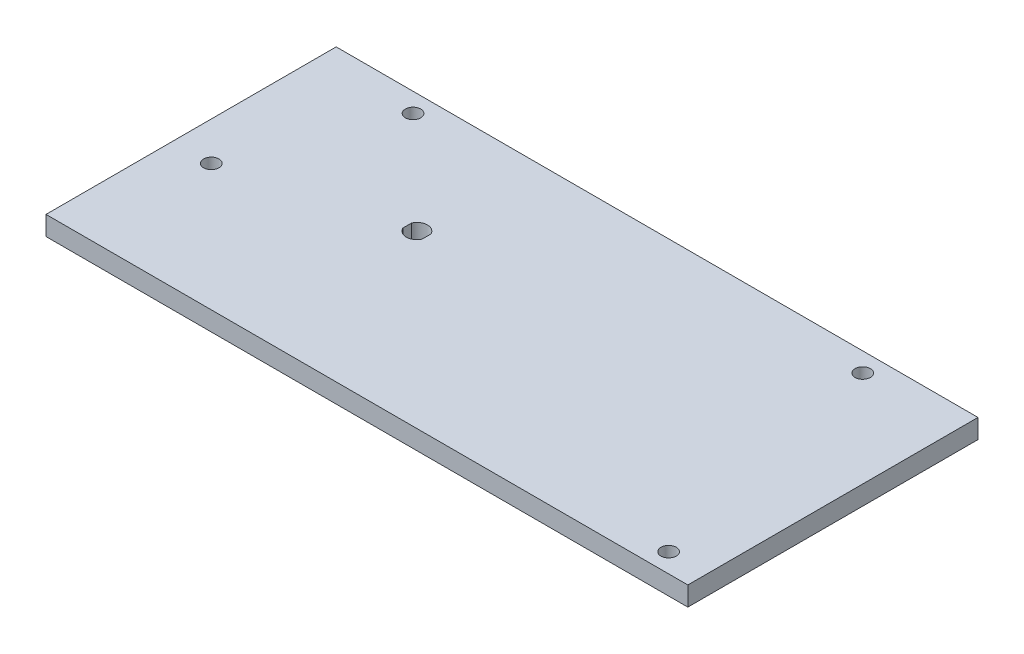
ISO-10303-21;
HEADER;
FILE_DESCRIPTION(('STEP AP214'),'2;1');
FILE_NAME('part.step','',(''),(''),'','','');
FILE_SCHEMA(('AUTOMOTIVE_DESIGN { 1 0 10303 214 1 1 1 1 }'));
ENDSEC;
DATA;
#1=APPLICATION_CONTEXT('core data for automotive mechanical design processes');
#2=APPLICATION_PROTOCOL_DEFINITION('international standard','automotive_design',2000,#1);
#3=PRODUCT_CONTEXT('',#1,'mechanical');
#4=PRODUCT('Part','Part','',(#3));
#5=PRODUCT_RELATED_PRODUCT_CATEGORY('part','',(#4));
#6=PRODUCT_DEFINITION_FORMATION('','',#4);
#7=PRODUCT_DEFINITION_CONTEXT('part definition',#1,'design');
#8=PRODUCT_DEFINITION('design','',#6,#7);
#9=PRODUCT_DEFINITION_SHAPE('','',#8);
#10=(LENGTH_UNIT() NAMED_UNIT(*) SI_UNIT(.MILLI.,.METRE.));
#11=(NAMED_UNIT(*) PLANE_ANGLE_UNIT() SI_UNIT($,.RADIAN.));
#12=(NAMED_UNIT(*) SI_UNIT($,.STERADIAN.) SOLID_ANGLE_UNIT());
#13=UNCERTAINTY_MEASURE_WITH_UNIT(LENGTH_MEASURE(1.E-05),#10,'distance_accuracy_value','');
#14=(GEOMETRIC_REPRESENTATION_CONTEXT(3) GLOBAL_UNCERTAINTY_ASSIGNED_CONTEXT((#13)) GLOBAL_UNIT_ASSIGNED_CONTEXT((#10,
#11,#12)) REPRESENTATION_CONTEXT('',''));
#15=CARTESIAN_POINT('',(0.,0.,0.));
#16=DIRECTION('',(0.,0.,1.));
#17=DIRECTION('',(1.,0.,0.));
#18=AXIS2_PLACEMENT_3D('',#15,#16,#17);
#19=CARTESIAN_POINT('',(0.,5.,0.));
#20=DIRECTION('',(0.,-1.,0.));
#21=DIRECTION('',(0.,0.,-1.));
#22=AXIS2_PLACEMENT_3D('',#19,#20,#21);
#23=PLANE('',#22);
#24=CARTESIAN_POINT('',(73.5,5.,32.75));
#25=DIRECTION('',(0.,1.,0.));
#26=DIRECTION('',(0.,0.,1.));
#27=AXIS2_PLACEMENT_3D('',#24,#25,#26);
#28=CIRCLE('',#27,2.);
#29=CARTESIAN_POINT('',(73.5,5.,34.75));
#30=VERTEX_POINT('',#29);
#31=EDGE_CURVE('E156',#30,#30,#28,.T.);
#32=ORIENTED_EDGE('',*,*,#31,.F.);
#33=EDGE_LOOP('',(#32));
#34=FACE_BOUND('',#33,.T.);
#35=CARTESIAN_POINT('',(-73.5,5.,4.75000000000001));
#36=DIRECTION('',(0.,1.,0.));
#37=DIRECTION('',(0.,0.,1.));
#38=AXIS2_PLACEMENT_3D('',#35,#36,#37);
#39=CIRCLE('',#38,2.);
#40=CARTESIAN_POINT('',(-73.5,5.,6.75000000000001));
#41=VERTEX_POINT('',#40);
#42=EDGE_CURVE('E164',#41,#41,#39,.T.);
#43=ORIENTED_EDGE('',*,*,#42,.F.);
#44=EDGE_LOOP('',(#43));
#45=FACE_BOUND('',#44,.T.);
#46=CARTESIAN_POINT('',(58.5,5.,-32.75));
#47=DIRECTION('',(0.,1.,0.));
#48=DIRECTION('',(0.,0.,1.));
#49=AXIS2_PLACEMENT_3D('',#46,#47,#48);
#50=CIRCLE('',#49,2.);
#51=CARTESIAN_POINT('',(58.5,5.,-30.75));
#52=VERTEX_POINT('',#51);
#53=EDGE_CURVE('E172',#52,#52,#50,.T.);
#54=ORIENTED_EDGE('',*,*,#53,.F.);
#55=EDGE_LOOP('',(#54));
#56=FACE_BOUND('',#55,.T.);
#57=CARTESIAN_POINT('',(-58.5,5.,-32.75));
#58=DIRECTION('',(0.,1.,0.));
#59=DIRECTION('',(0.,0.,1.));
#60=AXIS2_PLACEMENT_3D('',#57,#58,#59);
#61=CIRCLE('',#60,2.);
#62=CARTESIAN_POINT('',(-58.5,5.,-30.75));
#63=VERTEX_POINT('',#62);
#64=EDGE_CURVE('E180',#63,#63,#61,.T.);
#65=ORIENTED_EDGE('',*,*,#64,.F.);
#66=EDGE_LOOP('',(#65));
#67=FACE_BOUND('',#66,.T.);
#68=DIRECTION('',(0.,0.,-1.));
#69=VECTOR('',#68,1.);
#70=CARTESIAN_POINT('',(83.5,5.,37.75));
#71=LINE('',#70,#69);
#72=CARTESIAN_POINT('',(83.5,5.,37.75));
#73=VERTEX_POINT('',#72);
#74=CARTESIAN_POINT('',(83.5,5.,-37.75));
#75=VERTEX_POINT('',#74);
#76=EDGE_CURVE('E188',#73,#75,#71,.T.);
#77=ORIENTED_EDGE('',*,*,#76,.T.);
#78=DIRECTION('',(-1.,0.,0.));
#79=VECTOR('',#78,1.);
#80=CARTESIAN_POINT('',(-83.5,5.,-37.75));
#81=LINE('',#80,#79);
#82=CARTESIAN_POINT('',(-83.5,5.,-37.75));
#83=VERTEX_POINT('',#82);
#84=EDGE_CURVE('E192',#75,#83,#81,.T.);
#85=ORIENTED_EDGE('',*,*,#84,.T.);
#86=DIRECTION('',(0.,0.,1.));
#87=VECTOR('',#86,1.);
#88=CARTESIAN_POINT('',(-83.5,5.,37.75));
#89=LINE('',#88,#87);
#90=CARTESIAN_POINT('',(-83.5,5.,37.75));
#91=VERTEX_POINT('',#90);
#92=EDGE_CURVE('E196',#83,#91,#89,.T.);
#93=ORIENTED_EDGE('',*,*,#92,.T.);
#94=DIRECTION('',(1.,0.,0.));
#95=VECTOR('',#94,1.);
#96=CARTESIAN_POINT('',(-83.5,5.,37.75));
#97=LINE('',#96,#95);
#98=EDGE_CURVE('E199',#91,#73,#97,.T.);
#99=ORIENTED_EDGE('',*,*,#98,.T.);
#100=EDGE_LOOP('',(#77,#85,#93,#99));
#101=FACE_BOUND('',#100,.T.);
#102=DIRECTION('',(0.,0.,1.));
#103=VECTOR('',#102,1.);
#104=CARTESIAN_POINT('',(-29.,5.,0.));
#105=LINE('',#104,#103);
#106=CARTESIAN_POINT('',(-29.,5.,-7.89564392373895));
#107=VERTEX_POINT('',#106);
#108=CARTESIAN_POINT('',(-29.,5.,-5.60435607626103));
#109=VERTEX_POINT('',#108);
#110=EDGE_CURVE('E61',#107,#109,#105,.T.);
#111=ORIENTED_EDGE('',*,*,#110,.T.);
#112=CARTESIAN_POINT('',(-31.5,5.,-6.74999999999999));
#113=DIRECTION('',(0.,1.,0.));
#114=DIRECTION('',(0.,0.,1.));
#115=AXIS2_PLACEMENT_3D('',#112,#113,#114);
#116=CIRCLE('',#115,2.75);
#117=CARTESIAN_POINT('',(-34.,5.,-5.60435607626103));
#118=VERTEX_POINT('',#117);
#119=EDGE_CURVE('E131',#118,#109,#116,.T.);
#120=ORIENTED_EDGE('',*,*,#119,.F.);
#121=DIRECTION('',(0.,0.,1.));
#122=VECTOR('',#121,1.);
#123=CARTESIAN_POINT('',(-34.,5.,0.));
#124=LINE('',#123,#122);
#125=CARTESIAN_POINT('',(-34.,5.,-7.89564392373894));
#126=VERTEX_POINT('',#125);
#127=EDGE_CURVE('E135',#126,#118,#124,.T.);
#128=ORIENTED_EDGE('',*,*,#127,.F.);
#129=EDGE_CURVE('E137',#107,#126,#116,.T.);
#130=ORIENTED_EDGE('',*,*,#129,.F.);
#131=EDGE_LOOP('',(#111,#120,#128,#130));
#132=FACE_BOUND('',#131,.T.);
#133=ADVANCED_FACE('F45',(#34,#45,#56,#67,#101,#132),#23,.F.);
#134=CARTESIAN_POINT('',(0.,0.,0.));
#135=DIRECTION('',(0.,-1.,0.));
#136=DIRECTION('',(0.,0.,-1.));
#137=AXIS2_PLACEMENT_3D('',#134,#135,#136);
#138=PLANE('',#137);
#139=CARTESIAN_POINT('',(-73.5,0.,4.75000000000001));
#140=DIRECTION('',(0.,1.,0.));
#141=DIRECTION('',(0.,0.,1.));
#142=AXIS2_PLACEMENT_3D('',#139,#140,#141);
#143=CIRCLE('',#142,2.);
#144=CARTESIAN_POINT('',(-73.5,0.,6.75000000000001));
#145=VERTEX_POINT('',#144);
#146=EDGE_CURVE('E160',#145,#145,#143,.T.);
#147=ORIENTED_EDGE('',*,*,#146,.T.);
#148=EDGE_LOOP('',(#147));
#149=FACE_BOUND('',#148,.T.);
#150=CARTESIAN_POINT('',(-58.5,0.,-32.75));
#151=DIRECTION('',(0.,1.,0.));
#152=DIRECTION('',(0.,0.,1.));
#153=AXIS2_PLACEMENT_3D('',#150,#151,#152);
#154=CIRCLE('',#153,2.);
#155=CARTESIAN_POINT('',(-58.5,0.,-30.75));
#156=VERTEX_POINT('',#155);
#157=EDGE_CURVE('E176',#156,#156,#154,.T.);
#158=ORIENTED_EDGE('',*,*,#157,.T.);
#159=EDGE_LOOP('',(#158));
#160=FACE_BOUND('',#159,.T.);
#161=DIRECTION('',(0.,0.,-1.));
#162=VECTOR('',#161,1.);
#163=CARTESIAN_POINT('',(83.5,0.,37.75));
#164=LINE('',#163,#162);
#165=CARTESIAN_POINT('',(83.5,0.,37.75));
#166=VERTEX_POINT('',#165);
#167=CARTESIAN_POINT('',(83.5,0.,-37.75));
#168=VERTEX_POINT('',#167);
#169=EDGE_CURVE('E184',#166,#168,#164,.T.);
#170=ORIENTED_EDGE('',*,*,#169,.F.);
#171=DIRECTION('',(1.,0.,0.));
#172=VECTOR('',#171,1.);
#173=CARTESIAN_POINT('',(-83.5,0.,37.75));
#174=LINE('',#173,#172);
#175=CARTESIAN_POINT('',(-83.5,0.,37.75));
#176=VERTEX_POINT('',#175);
#177=EDGE_CURVE('E193',#176,#166,#174,.T.);
#178=ORIENTED_EDGE('',*,*,#177,.F.);
#179=DIRECTION('',(0.,0.,1.));
#180=VECTOR('',#179,1.);
#181=CARTESIAN_POINT('',(-83.5,0.,37.75));
#182=LINE('',#181,#180);
#183=CARTESIAN_POINT('',(-83.5,0.,-37.75));
#184=VERTEX_POINT('',#183);
#185=EDGE_CURVE('E209',#184,#176,#182,.T.);
#186=ORIENTED_EDGE('',*,*,#185,.F.);
#187=DIRECTION('',(-1.,0.,0.));
#188=VECTOR('',#187,1.);
#189=CARTESIAN_POINT('',(-83.5,0.,-37.75));
#190=LINE('',#189,#188);
#191=EDGE_CURVE('E206',#168,#184,#190,.T.);
#192=ORIENTED_EDGE('',*,*,#191,.F.);
#193=EDGE_LOOP('',(#170,#178,#186,#192));
#194=FACE_BOUND('',#193,.T.);
#195=CARTESIAN_POINT('',(58.5,0.,-32.75));
#196=DIRECTION('',(0.,1.,0.));
#197=DIRECTION('',(0.,0.,1.));
#198=AXIS2_PLACEMENT_3D('',#195,#196,#197);
#199=CIRCLE('',#198,2.);
#200=CARTESIAN_POINT('',(58.5,0.,-30.75));
#201=VERTEX_POINT('',#200);
#202=EDGE_CURVE('E168',#201,#201,#199,.T.);
#203=ORIENTED_EDGE('',*,*,#202,.T.);
#204=EDGE_LOOP('',(#203));
#205=FACE_BOUND('',#204,.T.);
#206=CARTESIAN_POINT('',(73.5,0.,32.75));
#207=DIRECTION('',(0.,1.,0.));
#208=DIRECTION('',(0.,0.,1.));
#209=AXIS2_PLACEMENT_3D('',#206,#207,#208);
#210=CIRCLE('',#209,2.);
#211=CARTESIAN_POINT('',(73.5,0.,34.75));
#212=VERTEX_POINT('',#211);
#213=EDGE_CURVE('E150',#212,#212,#210,.T.);
#214=ORIENTED_EDGE('',*,*,#213,.T.);
#215=EDGE_LOOP('',(#214));
#216=FACE_BOUND('',#215,.T.);
#217=CARTESIAN_POINT('',(-31.5,0.,-6.74999999999999));
#218=DIRECTION('',(0.,1.,0.));
#219=DIRECTION('',(0.,0.,1.));
#220=AXIS2_PLACEMENT_3D('',#217,#218,#219);
#221=CIRCLE('',#220,2.75);
#222=CARTESIAN_POINT('',(-34.,0.,-5.60435607626103));
#223=VERTEX_POINT('',#222);
#224=CARTESIAN_POINT('',(-29.,0.,-5.60435607626103));
#225=VERTEX_POINT('',#224);
#226=EDGE_CURVE('E119',#223,#225,#221,.T.);
#227=ORIENTED_EDGE('',*,*,#226,.T.);
#228=DIRECTION('',(0.,0.,1.));
#229=VECTOR('',#228,1.);
#230=CARTESIAN_POINT('',(-29.,0.,0.));
#231=LINE('',#230,#229);
#232=CARTESIAN_POINT('',(-29.,0.,-7.89564392373895));
#233=VERTEX_POINT('',#232);
#234=EDGE_CURVE('E112',#233,#225,#231,.T.);
#235=ORIENTED_EDGE('',*,*,#234,.F.);
#236=CARTESIAN_POINT('',(-34.,0.,-7.89564392373894));
#237=VERTEX_POINT('',#236);
#238=EDGE_CURVE('E122',#233,#237,#221,.T.);
#239=ORIENTED_EDGE('',*,*,#238,.T.);
#240=DIRECTION('',(0.,0.,1.));
#241=VECTOR('',#240,1.);
#242=CARTESIAN_POINT('',(-34.,0.,0.));
#243=LINE('',#242,#241);
#244=EDGE_CURVE('E69',#237,#223,#243,.T.);
#245=ORIENTED_EDGE('',*,*,#244,.T.);
#246=EDGE_LOOP('',(#227,#235,#239,#245));
#247=FACE_BOUND('',#246,.T.);
#248=ADVANCED_FACE('F128',(#149,#160,#194,#205,#216,#247),#138,.T.);
#249=CARTESIAN_POINT('',(83.5,5.,37.75));
#250=DIRECTION('',(-1.,0.,0.));
#251=DIRECTION('',(0.,0.,1.));
#252=AXIS2_PLACEMENT_3D('',#249,#250,#251);
#253=PLANE('',#252);
#254=ORIENTED_EDGE('',*,*,#169,.T.);
#255=DIRECTION('',(0.,-1.,0.));
#256=VECTOR('',#255,1.);
#257=CARTESIAN_POINT('',(83.5,5.,-37.75));
#258=LINE('',#257,#256);
#259=EDGE_CURVE('E11',#75,#168,#258,.T.);
#260=ORIENTED_EDGE('',*,*,#259,.F.);
#261=ORIENTED_EDGE('',*,*,#76,.F.);
#262=DIRECTION('',(0.,-1.,0.));
#263=VECTOR('',#262,1.);
#264=CARTESIAN_POINT('',(83.5,5.,37.75));
#265=LINE('',#264,#263);
#266=EDGE_CURVE('E202',#73,#166,#265,.T.);
#267=ORIENTED_EDGE('',*,*,#266,.T.);
#268=EDGE_LOOP('',(#254,#260,#261,#267));
#269=FACE_BOUND('',#268,.T.);
#270=ADVANCED_FACE('F47',(#269),#253,.F.);
#271=CARTESIAN_POINT('',(-83.5,5.,-37.75));
#272=DIRECTION('',(0.,0.,1.));
#273=DIRECTION('',(1.,0.,0.));
#274=AXIS2_PLACEMENT_3D('',#271,#272,#273);
#275=PLANE('',#274);
#276=ORIENTED_EDGE('',*,*,#191,.T.);
#277=DIRECTION('',(0.,-1.,0.));
#278=VECTOR('',#277,1.);
#279=CARTESIAN_POINT('',(-83.5,5.,-37.75));
#280=LINE('',#279,#278);
#281=EDGE_CURVE('E54',#83,#184,#280,.T.);
#282=ORIENTED_EDGE('',*,*,#281,.F.);
#283=ORIENTED_EDGE('',*,*,#84,.F.);
#284=ORIENTED_EDGE('',*,*,#259,.T.);
#285=EDGE_LOOP('',(#276,#282,#283,#284));
#286=FACE_BOUND('',#285,.T.);
#287=ADVANCED_FACE('F242',(#286),#275,.F.);
#288=CARTESIAN_POINT('',(-83.5,5.,37.75));
#289=DIRECTION('',(1.,0.,0.));
#290=DIRECTION('',(0.,0.,-1.));
#291=AXIS2_PLACEMENT_3D('',#288,#289,#290);
#292=PLANE('',#291);
#293=ORIENTED_EDGE('',*,*,#185,.T.);
#294=DIRECTION('',(0.,-1.,0.));
#295=VECTOR('',#294,1.);
#296=CARTESIAN_POINT('',(-83.5,5.,37.75));
#297=LINE('',#296,#295);
#298=EDGE_CURVE('E217',#91,#176,#297,.T.);
#299=ORIENTED_EDGE('',*,*,#298,.F.);
#300=ORIENTED_EDGE('',*,*,#92,.F.);
#301=ORIENTED_EDGE('',*,*,#281,.T.);
#302=EDGE_LOOP('',(#293,#299,#300,#301));
#303=FACE_BOUND('',#302,.T.);
#304=ADVANCED_FACE('F226',(#303),#292,.F.);
#305=CARTESIAN_POINT('',(-83.5,5.,37.75));
#306=DIRECTION('',(0.,0.,-1.));
#307=DIRECTION('',(-1.,0.,0.));
#308=AXIS2_PLACEMENT_3D('',#305,#306,#307);
#309=PLANE('',#308);
#310=ORIENTED_EDGE('',*,*,#177,.T.);
#311=ORIENTED_EDGE('',*,*,#266,.F.);
#312=ORIENTED_EDGE('',*,*,#98,.F.);
#313=ORIENTED_EDGE('',*,*,#298,.T.);
#314=EDGE_LOOP('',(#310,#311,#312,#313));
#315=FACE_BOUND('',#314,.T.);
#316=ADVANCED_FACE('F235',(#315),#309,.F.);
#317=CARTESIAN_POINT('',(-58.5,5.,-32.75));
#318=DIRECTION('',(0.,-1.,0.));
#319=DIRECTION('',(0.,0.,-1.));
#320=AXIS2_PLACEMENT_3D('',#317,#318,#319);
#321=CYLINDRICAL_SURFACE('',#320,2.);
#322=ORIENTED_EDGE('',*,*,#64,.T.);
#323=EDGE_LOOP('',(#322));
#324=FACE_BOUND('',#323,.T.);
#325=ORIENTED_EDGE('',*,*,#157,.F.);
#326=EDGE_LOOP('',(#325));
#327=FACE_BOUND('',#326,.T.);
#328=ADVANCED_FACE('F261',(#324,#327),#321,.F.);
#329=CARTESIAN_POINT('',(58.5,5.,-32.75));
#330=DIRECTION('',(0.,-1.,0.));
#331=DIRECTION('',(0.,0.,-1.));
#332=AXIS2_PLACEMENT_3D('',#329,#330,#331);
#333=CYLINDRICAL_SURFACE('',#332,2.);
#334=ORIENTED_EDGE('',*,*,#53,.T.);
#335=EDGE_LOOP('',(#334));
#336=FACE_BOUND('',#335,.T.);
#337=ORIENTED_EDGE('',*,*,#202,.F.);
#338=EDGE_LOOP('',(#337));
#339=FACE_BOUND('',#338,.T.);
#340=ADVANCED_FACE('F268',(#336,#339),#333,.F.);
#341=CARTESIAN_POINT('',(-73.5,5.,4.75000000000001));
#342=DIRECTION('',(0.,-1.,0.));
#343=DIRECTION('',(0.,0.,-1.));
#344=AXIS2_PLACEMENT_3D('',#341,#342,#343);
#345=CYLINDRICAL_SURFACE('',#344,2.);
#346=ORIENTED_EDGE('',*,*,#42,.T.);
#347=EDGE_LOOP('',(#346));
#348=FACE_BOUND('',#347,.T.);
#349=ORIENTED_EDGE('',*,*,#146,.F.);
#350=EDGE_LOOP('',(#349));
#351=FACE_BOUND('',#350,.T.);
#352=ADVANCED_FACE('F273',(#348,#351),#345,.F.);
#353=CARTESIAN_POINT('',(73.5,5.,32.75));
#354=DIRECTION('',(0.,-1.,0.));
#355=DIRECTION('',(0.,0.,-1.));
#356=AXIS2_PLACEMENT_3D('',#353,#354,#355);
#357=CYLINDRICAL_SURFACE('',#356,2.);
#358=ORIENTED_EDGE('',*,*,#31,.T.);
#359=EDGE_LOOP('',(#358));
#360=FACE_BOUND('',#359,.T.);
#361=ORIENTED_EDGE('',*,*,#213,.F.);
#362=EDGE_LOOP('',(#361));
#363=FACE_BOUND('',#362,.T.);
#364=ADVANCED_FACE('F283',(#360,#363),#357,.F.);
#365=CARTESIAN_POINT('',(-29.,0.,0.));
#366=DIRECTION('',(-1.,0.,0.));
#367=DIRECTION('',(0.,0.,1.));
#368=AXIS2_PLACEMENT_3D('',#365,#366,#367);
#369=PLANE('',#368);
#370=ORIENTED_EDGE('',*,*,#110,.F.);
#371=DIRECTION('',(0.,1.,0.));
#372=VECTOR('',#371,1.);
#373=CARTESIAN_POINT('',(-29.,0.,-7.89564392373895));
#374=LINE('',#373,#372);
#375=EDGE_CURVE('E108',#233,#107,#374,.T.);
#376=ORIENTED_EDGE('',*,*,#375,.F.);
#377=ORIENTED_EDGE('',*,*,#234,.T.);
#378=DIRECTION('',(0.,1.,0.));
#379=VECTOR('',#378,1.);
#380=CARTESIAN_POINT('',(-29.,0.,-5.60435607626103));
#381=LINE('',#380,#379);
#382=EDGE_CURVE('E147',#225,#109,#381,.T.);
#383=ORIENTED_EDGE('',*,*,#382,.T.);
#384=EDGE_LOOP('',(#370,#376,#377,#383));
#385=FACE_BOUND('',#384,.T.);
#386=ADVANCED_FACE('F110',(#385),#369,.T.);
#387=CARTESIAN_POINT('',(-31.5,0.,-6.74999999999999));
#388=DIRECTION('',(0.,1.,0.));
#389=DIRECTION('',(0.,0.,1.));
#390=AXIS2_PLACEMENT_3D('',#387,#388,#389);
#391=CYLINDRICAL_SURFACE('',#390,2.75);
#392=ORIENTED_EDGE('',*,*,#119,.T.);
#393=ORIENTED_EDGE('',*,*,#382,.F.);
#394=ORIENTED_EDGE('',*,*,#226,.F.);
#395=DIRECTION('',(0.,1.,0.));
#396=VECTOR('',#395,1.);
#397=CARTESIAN_POINT('',(-34.,0.,-5.60435607626103));
#398=LINE('',#397,#396);
#399=EDGE_CURVE('E151',#223,#118,#398,.T.);
#400=ORIENTED_EDGE('',*,*,#399,.T.);
#401=EDGE_LOOP('',(#392,#393,#394,#400));
#402=FACE_BOUND('',#401,.T.);
#403=ADVANCED_FACE('F292',(#402),#391,.F.);
#404=CARTESIAN_POINT('',(-34.,0.,0.));
#405=DIRECTION('',(-1.,0.,0.));
#406=DIRECTION('',(0.,0.,1.));
#407=AXIS2_PLACEMENT_3D('',#404,#405,#406);
#408=PLANE('',#407);
#409=ORIENTED_EDGE('',*,*,#127,.T.);
#410=ORIENTED_EDGE('',*,*,#399,.F.);
#411=ORIENTED_EDGE('',*,*,#244,.F.);
#412=DIRECTION('',(0.,1.,0.));
#413=VECTOR('',#412,1.);
#414=CARTESIAN_POINT('',(-34.,0.,-7.89564392373894));
#415=LINE('',#414,#413);
#416=EDGE_CURVE('E118',#237,#126,#415,.T.);
#417=ORIENTED_EDGE('',*,*,#416,.T.);
#418=EDGE_LOOP('',(#409,#410,#411,#417));
#419=FACE_BOUND('',#418,.T.);
#420=ADVANCED_FACE('F293',(#419),#408,.F.);
#421=ORIENTED_EDGE('',*,*,#129,.T.);
#422=ORIENTED_EDGE('',*,*,#416,.F.);
#423=ORIENTED_EDGE('',*,*,#238,.F.);
#424=ORIENTED_EDGE('',*,*,#375,.T.);
#425=EDGE_LOOP('',(#421,#422,#423,#424));
#426=FACE_BOUND('',#425,.T.);
#427=ADVANCED_FACE('F123',(#426),#391,.F.);
#428=CLOSED_SHELL('',(#133,#248,#270,#287,#304,#316,#328,#340,#352,#364,#386,#403,#420,#427));
#429=MANIFOLD_SOLID_BREP('B2',#428);
#430=ADVANCED_BREP_SHAPE_REPRESENTATION('',(#18,#429),#14);
#431=SHAPE_DEFINITION_REPRESENTATION(#9,#430);
ENDSEC;
END-ISO-10303-21;
